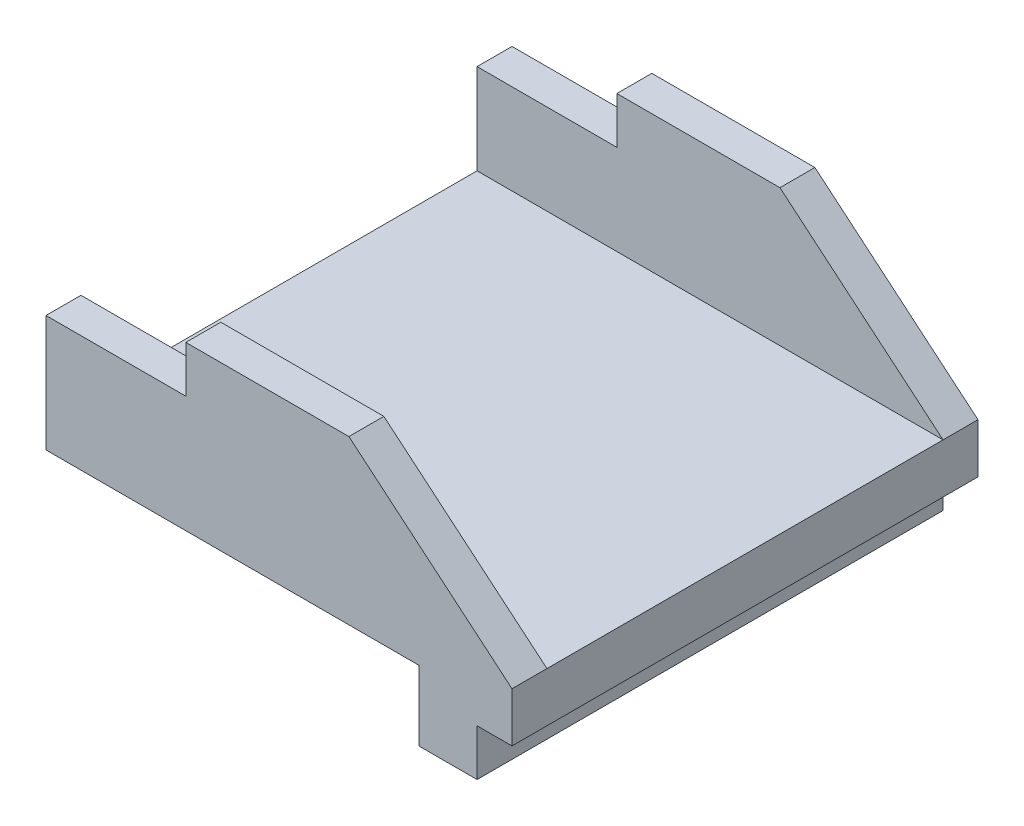
ISO-10303-21;
HEADER;
FILE_DESCRIPTION(('STEP AP214'),'2;1');
FILE_NAME('part.step','',(''),(''),'','','');
FILE_SCHEMA(('AUTOMOTIVE_DESIGN { 1 0 10303 214 1 1 1 1 }'));
ENDSEC;
DATA;
#1=APPLICATION_CONTEXT('core data for automotive mechanical design processes');
#2=APPLICATION_PROTOCOL_DEFINITION('international standard','automotive_design',2000,#1);
#3=PRODUCT_CONTEXT('',#1,'mechanical');
#4=PRODUCT('Part','Part','',(#3));
#5=PRODUCT_RELATED_PRODUCT_CATEGORY('part','',(#4));
#6=PRODUCT_DEFINITION_FORMATION('','',#4);
#7=PRODUCT_DEFINITION_CONTEXT('part definition',#1,'design');
#8=PRODUCT_DEFINITION('design','',#6,#7);
#9=PRODUCT_DEFINITION_SHAPE('','',#8);
#10=(LENGTH_UNIT() NAMED_UNIT(*) SI_UNIT(.MILLI.,.METRE.));
#11=(NAMED_UNIT(*) PLANE_ANGLE_UNIT() SI_UNIT($,.RADIAN.));
#12=(NAMED_UNIT(*) SI_UNIT($,.STERADIAN.) SOLID_ANGLE_UNIT());
#13=UNCERTAINTY_MEASURE_WITH_UNIT(LENGTH_MEASURE(1.E-05),#10,'distance_accuracy_value','');
#14=(GEOMETRIC_REPRESENTATION_CONTEXT(3) GLOBAL_UNCERTAINTY_ASSIGNED_CONTEXT((#13)) GLOBAL_UNIT_ASSIGNED_CONTEXT((#10,
#11,#12)) REPRESENTATION_CONTEXT('',''));
#15=CARTESIAN_POINT('',(0.,0.,0.));
#16=DIRECTION('',(0.,0.,1.));
#17=DIRECTION('',(1.,0.,0.));
#18=AXIS2_PLACEMENT_3D('',#15,#16,#17);
#19=CARTESIAN_POINT('',(-10.,-5.,10.));
#20=DIRECTION('',(1.,0.,0.));
#21=DIRECTION('',(0.,0.,-1.));
#22=AXIS2_PLACEMENT_3D('',#19,#20,#21);
#23=PLANE('',#22);
#24=DIRECTION('',(0.,1.,0.));
#25=VECTOR('',#24,1.);
#26=CARTESIAN_POINT('',(-10.,-5.,8.5));
#27=LINE('',#26,#25);
#28=CARTESIAN_POINT('',(-10.,-0.873697418241024,8.5));
#29=VERTEX_POINT('',#28);
#30=CARTESIAN_POINT('',(-10.,3.,8.5));
#31=VERTEX_POINT('',#30);
#32=EDGE_CURVE('E172',#29,#31,#27,.T.);
#33=ORIENTED_EDGE('',*,*,#32,.F.);
#34=DIRECTION('',(0.,0.,1.));
#35=VECTOR('',#34,1.);
#36=CARTESIAN_POINT('',(-10.,-0.873697418241024,10.));
#37=LINE('',#36,#35);
#38=CARTESIAN_POINT('',(-10.,-0.873697418241022,-8.5));
#39=VERTEX_POINT('',#38);
#40=EDGE_CURVE('E158',#39,#29,#37,.T.);
#41=ORIENTED_EDGE('',*,*,#40,.F.);
#42=DIRECTION('',(0.,-1.,0.));
#43=VECTOR('',#42,1.);
#44=CARTESIAN_POINT('',(-10.,-5.,-8.5));
#45=LINE('',#44,#43);
#46=CARTESIAN_POINT('',(-10.,3.,-8.5));
#47=VERTEX_POINT('',#46);
#48=EDGE_CURVE('E150',#47,#39,#45,.T.);
#49=ORIENTED_EDGE('',*,*,#48,.F.);
#50=DIRECTION('',(0.,0.,1.));
#51=VECTOR('',#50,1.);
#52=CARTESIAN_POINT('',(-10.,3.,-10.));
#53=LINE('',#52,#51);
#54=CARTESIAN_POINT('',(-10.,3.,-10.));
#55=VERTEX_POINT('',#54);
#56=EDGE_CURVE('E240',#55,#47,#53,.T.);
#57=ORIENTED_EDGE('',*,*,#56,.F.);
#58=DIRECTION('',(0.,-1.,0.));
#59=VECTOR('',#58,1.);
#60=CARTESIAN_POINT('',(-10.,-5.,-10.));
#61=LINE('',#60,#59);
#62=CARTESIAN_POINT('',(-10.,-2.,-10.));
#63=VERTEX_POINT('',#62);
#64=EDGE_CURVE('E242',#55,#63,#61,.T.);
#65=ORIENTED_EDGE('',*,*,#64,.T.);
#66=DIRECTION('',(0.,0.,1.));
#67=VECTOR('',#66,1.);
#68=CARTESIAN_POINT('',(-10.,-2.,-10.));
#69=LINE('',#68,#67);
#70=CARTESIAN_POINT('',(-10.,-2.,10.));
#71=VERTEX_POINT('',#70);
#72=EDGE_CURVE('E224',#63,#71,#69,.T.);
#73=ORIENTED_EDGE('',*,*,#72,.T.);
#74=DIRECTION('',(0.,-1.,0.));
#75=VECTOR('',#74,1.);
#76=CARTESIAN_POINT('',(-10.,-5.,10.));
#77=LINE('',#76,#75);
#78=CARTESIAN_POINT('',(-10.,3.,10.));
#79=VERTEX_POINT('',#78);
#80=EDGE_CURVE('E251',#79,#71,#77,.T.);
#81=ORIENTED_EDGE('',*,*,#80,.F.);
#82=EDGE_CURVE('E243',#31,#79,#53,.T.);
#83=ORIENTED_EDGE('',*,*,#82,.F.);
#84=EDGE_LOOP('',(#33,#41,#49,#57,#65,#73,#81,#83));
#85=FACE_BOUND('',#84,.T.);
#86=ADVANCED_FACE('F35',(#85),#23,.F.);
#87=CARTESIAN_POINT('',(10.,5.,10.));
#88=DIRECTION('',(0.,-1.,0.));
#89=DIRECTION('',(1.,0.,0.));
#90=AXIS2_PLACEMENT_3D('',#87,#88,#89);
#91=PLANE('',#90);
#92=DIRECTION('',(-1.,0.,0.));
#93=VECTOR('',#92,1.);
#94=CARTESIAN_POINT('',(20.,5.,8.5));
#95=LINE('',#94,#93);
#96=CARTESIAN_POINT('',(3.,5.,8.5));
#97=VERTEX_POINT('',#96);
#98=CARTESIAN_POINT('',(-4.,5.,8.5));
#99=VERTEX_POINT('',#98);
#100=EDGE_CURVE('E330',#97,#99,#95,.T.);
#101=ORIENTED_EDGE('',*,*,#100,.T.);
#102=DIRECTION('',(0.,0.,1.));
#103=VECTOR('',#102,1.);
#104=CARTESIAN_POINT('',(-4.,5.,-10.));
#105=LINE('',#104,#103);
#106=CARTESIAN_POINT('',(-4.,5.,10.));
#107=VERTEX_POINT('',#106);
#108=EDGE_CURVE('E247',#99,#107,#105,.T.);
#109=ORIENTED_EDGE('',*,*,#108,.T.);
#110=DIRECTION('',(-1.,0.,0.));
#111=VECTOR('',#110,1.);
#112=CARTESIAN_POINT('',(10.,5.,10.));
#113=LINE('',#112,#111);
#114=CARTESIAN_POINT('',(3.,5.,10.));
#115=VERTEX_POINT('',#114);
#116=EDGE_CURVE('E261',#115,#107,#113,.T.);
#117=ORIENTED_EDGE('',*,*,#116,.F.);
#118=DIRECTION('',(0.,0.,1.));
#119=VECTOR('',#118,1.);
#120=CARTESIAN_POINT('',(3.,5.,-10.));
#121=LINE('',#120,#119);
#122=EDGE_CURVE('E200',#97,#115,#121,.T.);
#123=ORIENTED_EDGE('',*,*,#122,.F.);
#124=EDGE_LOOP('',(#101,#109,#117,#123));
#125=FACE_BOUND('',#124,.T.);
#126=ADVANCED_FACE('F328',(#125),#91,.F.);
#127=DIRECTION('',(-1.,0.,0.));
#128=VECTOR('',#127,1.);
#129=CARTESIAN_POINT('',(20.,5.,-8.5));
#130=LINE('',#129,#128);
#131=CARTESIAN_POINT('',(3.,5.,-8.5));
#132=VERTEX_POINT('',#131);
#133=CARTESIAN_POINT('',(-4.,5.,-8.5));
#134=VERTEX_POINT('',#133);
#135=EDGE_CURVE('E168',#132,#134,#130,.T.);
#136=ORIENTED_EDGE('',*,*,#135,.F.);
#137=CARTESIAN_POINT('',(3.,5.,-10.));
#138=VERTEX_POINT('',#137);
#139=EDGE_CURVE('E210',#138,#132,#121,.T.);
#140=ORIENTED_EDGE('',*,*,#139,.F.);
#141=DIRECTION('',(-1.,0.,0.));
#142=VECTOR('',#141,1.);
#143=CARTESIAN_POINT('',(10.,5.,-10.));
#144=LINE('',#143,#142);
#145=CARTESIAN_POINT('',(-4.,5.,-10.));
#146=VERTEX_POINT('',#145);
#147=EDGE_CURVE('E255',#138,#146,#144,.T.);
#148=ORIENTED_EDGE('',*,*,#147,.T.);
#149=EDGE_CURVE('E244',#146,#134,#105,.T.);
#150=ORIENTED_EDGE('',*,*,#149,.T.);
#151=EDGE_LOOP('',(#136,#140,#148,#150));
#152=FACE_BOUND('',#151,.T.);
#153=ADVANCED_FACE('F278',(#152),#91,.F.);
#154=CARTESIAN_POINT('',(0.,3.,-10.));
#155=DIRECTION('',(0.,-1.,0.));
#156=DIRECTION('',(0.,0.,-1.));
#157=AXIS2_PLACEMENT_3D('',#154,#155,#156);
#158=PLANE('',#157);
#159=DIRECTION('',(1.,0.,0.));
#160=VECTOR('',#159,1.);
#161=CARTESIAN_POINT('',(0.,3.,8.5));
#162=LINE('',#161,#160);
#163=CARTESIAN_POINT('',(-4.,3.,8.5));
#164=VERTEX_POINT('',#163);
#165=EDGE_CURVE('E175',#31,#164,#162,.T.);
#166=ORIENTED_EDGE('',*,*,#165,.F.);
#167=ORIENTED_EDGE('',*,*,#82,.T.);
#168=DIRECTION('',(1.,0.,0.));
#169=VECTOR('',#168,1.);
#170=CARTESIAN_POINT('',(0.,3.,10.));
#171=LINE('',#170,#169);
#172=CARTESIAN_POINT('',(-4.,3.,10.));
#173=VERTEX_POINT('',#172);
#174=EDGE_CURVE('E208',#79,#173,#171,.T.);
#175=ORIENTED_EDGE('',*,*,#174,.T.);
#176=DIRECTION('',(0.,0.,1.));
#177=VECTOR('',#176,1.);
#178=CARTESIAN_POINT('',(-4.,3.,-10.));
#179=LINE('',#178,#177);
#180=EDGE_CURVE('E235',#164,#173,#179,.T.);
#181=ORIENTED_EDGE('',*,*,#180,.F.);
#182=EDGE_LOOP('',(#166,#167,#175,#181));
#183=FACE_BOUND('',#182,.T.);
#184=ADVANCED_FACE('F318',(#183),#158,.F.);
#185=DIRECTION('',(-1.,0.,0.));
#186=VECTOR('',#185,1.);
#187=CARTESIAN_POINT('',(0.,3.,-8.5));
#188=LINE('',#187,#186);
#189=CARTESIAN_POINT('',(-4.,3.,-8.5));
#190=VERTEX_POINT('',#189);
#191=EDGE_CURVE('E153',#190,#47,#188,.T.);
#192=ORIENTED_EDGE('',*,*,#191,.F.);
#193=CARTESIAN_POINT('',(-4.,3.,-10.));
#194=VERTEX_POINT('',#193);
#195=EDGE_CURVE('E248',#194,#190,#179,.T.);
#196=ORIENTED_EDGE('',*,*,#195,.F.);
#197=DIRECTION('',(1.,0.,0.));
#198=VECTOR('',#197,1.);
#199=CARTESIAN_POINT('',(0.,3.,-10.));
#200=LINE('',#199,#198);
#201=EDGE_CURVE('E228',#55,#194,#200,.T.);
#202=ORIENTED_EDGE('',*,*,#201,.F.);
#203=ORIENTED_EDGE('',*,*,#56,.T.);
#204=EDGE_LOOP('',(#192,#196,#202,#203));
#205=FACE_BOUND('',#204,.T.);
#206=ADVANCED_FACE('F448',(#205),#158,.F.);
#207=CARTESIAN_POINT('',(-4.,0.,-10.));
#208=DIRECTION('',(1.,0.,0.));
#209=DIRECTION('',(0.,0.,-1.));
#210=AXIS2_PLACEMENT_3D('',#207,#208,#209);
#211=PLANE('',#210);
#212=DIRECTION('',(0.,1.,0.));
#213=VECTOR('',#212,1.);
#214=CARTESIAN_POINT('',(-4.,0.,8.5));
#215=LINE('',#214,#213);
#216=EDGE_CURVE('E173',#164,#99,#215,.T.);
#217=ORIENTED_EDGE('',*,*,#216,.F.);
#218=ORIENTED_EDGE('',*,*,#180,.T.);
#219=DIRECTION('',(0.,1.,0.));
#220=VECTOR('',#219,1.);
#221=CARTESIAN_POINT('',(-4.,0.,10.));
#222=LINE('',#221,#220);
#223=EDGE_CURVE('E232',#173,#107,#222,.T.);
#224=ORIENTED_EDGE('',*,*,#223,.T.);
#225=ORIENTED_EDGE('',*,*,#108,.F.);
#226=EDGE_LOOP('',(#217,#218,#224,#225));
#227=FACE_BOUND('',#226,.T.);
#228=ADVANCED_FACE('F325',(#227),#211,.F.);
#229=DIRECTION('',(0.,-1.,0.));
#230=VECTOR('',#229,1.);
#231=CARTESIAN_POINT('',(-4.,0.,-8.5));
#232=LINE('',#231,#230);
#233=EDGE_CURVE('E332',#134,#190,#232,.T.);
#234=ORIENTED_EDGE('',*,*,#233,.F.);
#235=ORIENTED_EDGE('',*,*,#149,.F.);
#236=DIRECTION('',(0.,1.,0.));
#237=VECTOR('',#236,1.);
#238=CARTESIAN_POINT('',(-4.,0.,-10.));
#239=LINE('',#238,#237);
#240=EDGE_CURVE('E231',#194,#146,#239,.T.);
#241=ORIENTED_EDGE('',*,*,#240,.F.);
#242=ORIENTED_EDGE('',*,*,#195,.T.);
#243=EDGE_LOOP('',(#234,#235,#241,#242));
#244=FACE_BOUND('',#243,.T.);
#245=ADVANCED_FACE('F340',(#244),#211,.F.);
#246=CARTESIAN_POINT('',(3.70154711603014,4.41133207368561,-10.));
#247=DIRECTION('',(-0.642787609686543,-0.766044443118975,0.));
#248=DIRECTION('',(0.766044443118975,-0.642787609686543,0.));
#249=AXIS2_PLACEMENT_3D('',#246,#247,#248);
#250=PLANE('',#249);
#251=DIRECTION('',(0.766044443118975,-0.642787609686543,0.));
#252=VECTOR('',#251,1.);
#253=CARTESIAN_POINT('',(3.70154711603014,4.41133207368561,8.5));
#254=LINE('',#253,#252);
#255=CARTESIAN_POINT('',(10.,-0.873697418241024,8.5));
#256=VERTEX_POINT('',#255);
#257=EDGE_CURVE('E11',#97,#256,#254,.T.);
#258=ORIENTED_EDGE('',*,*,#257,.F.);
#259=ORIENTED_EDGE('',*,*,#122,.T.);
#260=DIRECTION('',(0.766044443118975,-0.642787609686543,0.));
#261=VECTOR('',#260,1.);
#262=CARTESIAN_POINT('',(3.70154711603014,4.41133207368561,10.));
#263=LINE('',#262,#261);
#264=CARTESIAN_POINT('',(10.,-0.873697418241024,10.));
#265=VERTEX_POINT('',#264);
#266=EDGE_CURVE('E201',#115,#265,#263,.T.);
#267=ORIENTED_EDGE('',*,*,#266,.T.);
#268=DIRECTION('',(0.,0.,1.));
#269=VECTOR('',#268,1.);
#270=CARTESIAN_POINT('',(10.,-0.873697418241024,-10.));
#271=LINE('',#270,#269);
#272=EDGE_CURVE('E209',#256,#265,#271,.T.);
#273=ORIENTED_EDGE('',*,*,#272,.F.);
#274=EDGE_LOOP('',(#258,#259,#267,#273));
#275=FACE_BOUND('',#274,.T.);
#276=ADVANCED_FACE('F338',(#275),#250,.F.);
#277=DIRECTION('',(-0.766044443118975,0.642787609686543,0.));
#278=VECTOR('',#277,1.);
#279=CARTESIAN_POINT('',(3.70154711603014,4.41133207368561,-8.5));
#280=LINE('',#279,#278);
#281=CARTESIAN_POINT('',(10.,-0.873697418241024,-8.5));
#282=VERTEX_POINT('',#281);
#283=EDGE_CURVE('E42',#282,#132,#280,.T.);
#284=ORIENTED_EDGE('',*,*,#283,.F.);
#285=CARTESIAN_POINT('',(10.,-0.873697418241024,-10.));
#286=VERTEX_POINT('',#285);
#287=EDGE_CURVE('E205',#286,#282,#271,.T.);
#288=ORIENTED_EDGE('',*,*,#287,.F.);
#289=DIRECTION('',(0.766044443118975,-0.642787609686543,0.));
#290=VECTOR('',#289,1.);
#291=CARTESIAN_POINT('',(3.70154711603014,4.41133207368561,-10.));
#292=LINE('',#291,#290);
#293=EDGE_CURVE('E197',#138,#286,#292,.T.);
#294=ORIENTED_EDGE('',*,*,#293,.F.);
#295=ORIENTED_EDGE('',*,*,#139,.T.);
#296=EDGE_LOOP('',(#284,#288,#294,#295));
#297=FACE_BOUND('',#296,.T.);
#298=ADVANCED_FACE('F281',(#297),#250,.F.);
#299=CARTESIAN_POINT('',(10.,-5.,10.));
#300=DIRECTION('',(0.,1.,0.));
#301=DIRECTION('',(-1.,0.,0.));
#302=AXIS2_PLACEMENT_3D('',#299,#300,#301);
#303=PLANE('',#302);
#304=DIRECTION('',(0.,0.,1.));
#305=VECTOR('',#304,1.);
#306=CARTESIAN_POINT('',(6.,-5.,-10.));
#307=LINE('',#306,#305);
#308=CARTESIAN_POINT('',(6.,-5.,-10.));
#309=VERTEX_POINT('',#308);
#310=CARTESIAN_POINT('',(6.,-5.,10.));
#311=VERTEX_POINT('',#310);
#312=EDGE_CURVE('E204',#309,#311,#307,.T.);
#313=ORIENTED_EDGE('',*,*,#312,.F.);
#314=DIRECTION('',(1.,0.,0.));
#315=VECTOR('',#314,1.);
#316=CARTESIAN_POINT('',(10.,-5.,-10.));
#317=LINE('',#316,#315);
#318=CARTESIAN_POINT('',(8.5,-5.,-10.));
#319=VERTEX_POINT('',#318);
#320=EDGE_CURVE('E266',#309,#319,#317,.T.);
#321=ORIENTED_EDGE('',*,*,#320,.T.);
#322=DIRECTION('',(0.,0.,1.));
#323=VECTOR('',#322,1.);
#324=CARTESIAN_POINT('',(8.5,-5.,-10.));
#325=LINE('',#324,#323);
#326=CARTESIAN_POINT('',(8.5,-5.,10.));
#327=VERTEX_POINT('',#326);
#328=EDGE_CURVE('E57',#319,#327,#325,.T.);
#329=ORIENTED_EDGE('',*,*,#328,.T.);
#330=DIRECTION('',(1.,0.,0.));
#331=VECTOR('',#330,1.);
#332=CARTESIAN_POINT('',(10.,-5.,10.));
#333=LINE('',#332,#331);
#334=EDGE_CURVE('E254',#311,#327,#333,.T.);
#335=ORIENTED_EDGE('',*,*,#334,.F.);
#336=EDGE_LOOP('',(#313,#321,#329,#335));
#337=FACE_BOUND('',#336,.T.);
#338=ADVANCED_FACE('F301',(#337),#303,.F.);
#339=CARTESIAN_POINT('',(10.,-5.,10.));
#340=DIRECTION('',(-1.,0.,0.));
#341=DIRECTION('',(0.,0.,1.));
#342=AXIS2_PLACEMENT_3D('',#339,#340,#341);
#343=PLANE('',#342);
#344=DIRECTION('',(0.,1.,0.));
#345=VECTOR('',#344,1.);
#346=CARTESIAN_POINT('',(10.,-5.,-10.));
#347=LINE('',#346,#345);
#348=CARTESIAN_POINT('',(10.,-3.,-10.));
#349=VERTEX_POINT('',#348);
#350=EDGE_CURVE('E269',#349,#286,#347,.T.);
#351=ORIENTED_EDGE('',*,*,#350,.T.);
#352=ORIENTED_EDGE('',*,*,#287,.T.);
#353=EDGE_CURVE('E165',#282,#256,#271,.T.);
#354=ORIENTED_EDGE('',*,*,#353,.T.);
#355=ORIENTED_EDGE('',*,*,#272,.T.);
#356=DIRECTION('',(0.,1.,0.));
#357=VECTOR('',#356,1.);
#358=CARTESIAN_POINT('',(10.,-5.,10.));
#359=LINE('',#358,#357);
#360=CARTESIAN_POINT('',(10.,-3.,10.));
#361=VERTEX_POINT('',#360);
#362=EDGE_CURVE('E258',#361,#265,#359,.T.);
#363=ORIENTED_EDGE('',*,*,#362,.F.);
#364=DIRECTION('',(0.,0.,1.));
#365=VECTOR('',#364,1.);
#366=CARTESIAN_POINT('',(10.,-3.,-10.));
#367=LINE('',#366,#365);
#368=EDGE_CURVE('E192',#349,#361,#367,.T.);
#369=ORIENTED_EDGE('',*,*,#368,.F.);
#370=EDGE_LOOP('',(#351,#352,#354,#355,#363,#369));
#371=FACE_BOUND('',#370,.T.);
#372=ADVANCED_FACE('F288',(#371),#343,.F.);
#373=CARTESIAN_POINT('',(0.,0.,10.));
#374=DIRECTION('',(0.,0.,1.));
#375=DIRECTION('',(1.,0.,0.));
#376=AXIS2_PLACEMENT_3D('',#373,#374,#375);
#377=PLANE('',#376);
#378=ORIENTED_EDGE('',*,*,#266,.F.);
#379=ORIENTED_EDGE('',*,*,#116,.T.);
#380=ORIENTED_EDGE('',*,*,#223,.F.);
#381=ORIENTED_EDGE('',*,*,#174,.F.);
#382=ORIENTED_EDGE('',*,*,#80,.T.);
#383=DIRECTION('',(1.,0.,0.));
#384=VECTOR('',#383,1.);
#385=CARTESIAN_POINT('',(0.,-2.,10.));
#386=LINE('',#385,#384);
#387=CARTESIAN_POINT('',(6.,-2.,10.));
#388=VERTEX_POINT('',#387);
#389=EDGE_CURVE('E216',#71,#388,#386,.T.);
#390=ORIENTED_EDGE('',*,*,#389,.T.);
#391=DIRECTION('',(0.,-1.,0.));
#392=VECTOR('',#391,1.);
#393=CARTESIAN_POINT('',(6.,0.,10.));
#394=LINE('',#393,#392);
#395=EDGE_CURVE('E194',#388,#311,#394,.T.);
#396=ORIENTED_EDGE('',*,*,#395,.T.);
#397=ORIENTED_EDGE('',*,*,#334,.T.);
#398=DIRECTION('',(0.,1.,0.));
#399=VECTOR('',#398,1.);
#400=CARTESIAN_POINT('',(8.5,0.,10.));
#401=LINE('',#400,#399);
#402=CARTESIAN_POINT('',(8.5,-3.,10.));
#403=VERTEX_POINT('',#402);
#404=EDGE_CURVE('E185',#327,#403,#401,.T.);
#405=ORIENTED_EDGE('',*,*,#404,.T.);
#406=DIRECTION('',(1.,0.,0.));
#407=VECTOR('',#406,1.);
#408=CARTESIAN_POINT('',(0.,-3.,10.));
#409=LINE('',#408,#407);
#410=EDGE_CURVE('E181',#403,#361,#409,.T.);
#411=ORIENTED_EDGE('',*,*,#410,.T.);
#412=ORIENTED_EDGE('',*,*,#362,.T.);
#413=EDGE_LOOP('',(#378,#379,#380,#381,#382,#390,#396,#397,#405,#411,#412));
#414=FACE_BOUND('',#413,.T.);
#415=ADVANCED_FACE('F296',(#414),#377,.T.);
#416=CARTESIAN_POINT('',(0.,0.,-10.));
#417=DIRECTION('',(0.,0.,1.));
#418=DIRECTION('',(1.,0.,0.));
#419=AXIS2_PLACEMENT_3D('',#416,#417,#418);
#420=PLANE('',#419);
#421=ORIENTED_EDGE('',*,*,#147,.F.);
#422=ORIENTED_EDGE('',*,*,#293,.T.);
#423=ORIENTED_EDGE('',*,*,#350,.F.);
#424=DIRECTION('',(1.,0.,0.));
#425=VECTOR('',#424,1.);
#426=CARTESIAN_POINT('',(0.,-3.,-10.));
#427=LINE('',#426,#425);
#428=CARTESIAN_POINT('',(8.5,-3.,-10.));
#429=VERTEX_POINT('',#428);
#430=EDGE_CURVE('E182',#429,#349,#427,.T.);
#431=ORIENTED_EDGE('',*,*,#430,.F.);
#432=DIRECTION('',(0.,1.,0.));
#433=VECTOR('',#432,1.);
#434=CARTESIAN_POINT('',(8.5,0.,-10.));
#435=LINE('',#434,#433);
#436=EDGE_CURVE('E184',#319,#429,#435,.T.);
#437=ORIENTED_EDGE('',*,*,#436,.F.);
#438=ORIENTED_EDGE('',*,*,#320,.F.);
#439=DIRECTION('',(0.,-1.,0.));
#440=VECTOR('',#439,1.);
#441=CARTESIAN_POINT('',(6.,0.,-10.));
#442=LINE('',#441,#440);
#443=CARTESIAN_POINT('',(6.,-2.,-10.));
#444=VERTEX_POINT('',#443);
#445=EDGE_CURVE('E213',#444,#309,#442,.T.);
#446=ORIENTED_EDGE('',*,*,#445,.F.);
#447=DIRECTION('',(1.,0.,0.));
#448=VECTOR('',#447,1.);
#449=CARTESIAN_POINT('',(0.,-2.,-10.));
#450=LINE('',#449,#448);
#451=EDGE_CURVE('E215',#63,#444,#450,.T.);
#452=ORIENTED_EDGE('',*,*,#451,.F.);
#453=ORIENTED_EDGE('',*,*,#64,.F.);
#454=ORIENTED_EDGE('',*,*,#201,.T.);
#455=ORIENTED_EDGE('',*,*,#240,.T.);
#456=EDGE_LOOP('',(#421,#422,#423,#431,#437,#438,#446,#452,#453,#454,#455));
#457=FACE_BOUND('',#456,.T.);
#458=ADVANCED_FACE('F284',(#457),#420,.F.);
#459=CARTESIAN_POINT('',(0.,-3.,-10.));
#460=DIRECTION('',(0.,-1.,0.));
#461=DIRECTION('',(0.,0.,-1.));
#462=AXIS2_PLACEMENT_3D('',#459,#460,#461);
#463=PLANE('',#462);
#464=ORIENTED_EDGE('',*,*,#410,.F.);
#465=DIRECTION('',(0.,0.,1.));
#466=VECTOR('',#465,1.);
#467=CARTESIAN_POINT('',(8.5,-3.,-10.));
#468=LINE('',#467,#466);
#469=EDGE_CURVE('E187',#429,#403,#468,.T.);
#470=ORIENTED_EDGE('',*,*,#469,.F.);
#471=ORIENTED_EDGE('',*,*,#430,.T.);
#472=ORIENTED_EDGE('',*,*,#368,.T.);
#473=EDGE_LOOP('',(#464,#470,#471,#472));
#474=FACE_BOUND('',#473,.T.);
#475=ADVANCED_FACE('F292',(#474),#463,.T.);
#476=CARTESIAN_POINT('',(8.5,0.,-10.));
#477=DIRECTION('',(1.,0.,0.));
#478=DIRECTION('',(0.,0.,-1.));
#479=AXIS2_PLACEMENT_3D('',#476,#477,#478);
#480=PLANE('',#479);
#481=ORIENTED_EDGE('',*,*,#404,.F.);
#482=ORIENTED_EDGE('',*,*,#328,.F.);
#483=ORIENTED_EDGE('',*,*,#436,.T.);
#484=ORIENTED_EDGE('',*,*,#469,.T.);
#485=EDGE_LOOP('',(#481,#482,#483,#484));
#486=FACE_BOUND('',#485,.T.);
#487=ADVANCED_FACE('F298',(#486),#480,.T.);
#488=CARTESIAN_POINT('',(6.,0.,-10.));
#489=DIRECTION('',(-1.,0.,0.));
#490=DIRECTION('',(0.,0.,1.));
#491=AXIS2_PLACEMENT_3D('',#488,#489,#490);
#492=PLANE('',#491);
#493=ORIENTED_EDGE('',*,*,#395,.F.);
#494=DIRECTION('',(0.,0.,1.));
#495=VECTOR('',#494,1.);
#496=CARTESIAN_POINT('',(6.,-2.,-10.));
#497=LINE('',#496,#495);
#498=EDGE_CURVE('E218',#444,#388,#497,.T.);
#499=ORIENTED_EDGE('',*,*,#498,.F.);
#500=ORIENTED_EDGE('',*,*,#445,.T.);
#501=ORIENTED_EDGE('',*,*,#312,.T.);
#502=EDGE_LOOP('',(#493,#499,#500,#501));
#503=FACE_BOUND('',#502,.T.);
#504=ADVANCED_FACE('F309',(#503),#492,.T.);
#505=CARTESIAN_POINT('',(0.,-2.,-10.));
#506=DIRECTION('',(0.,-1.,0.));
#507=DIRECTION('',(0.,0.,-1.));
#508=AXIS2_PLACEMENT_3D('',#505,#506,#507);
#509=PLANE('',#508);
#510=ORIENTED_EDGE('',*,*,#389,.F.);
#511=ORIENTED_EDGE('',*,*,#72,.F.);
#512=ORIENTED_EDGE('',*,*,#451,.T.);
#513=ORIENTED_EDGE('',*,*,#498,.T.);
#514=EDGE_LOOP('',(#510,#511,#512,#513));
#515=FACE_BOUND('',#514,.T.);
#516=ADVANCED_FACE('F311',(#515),#509,.T.);
#517=CARTESIAN_POINT('',(20.,5.,8.5));
#518=DIRECTION('',(0.,0.,-1.));
#519=DIRECTION('',(-1.,0.,0.));
#520=AXIS2_PLACEMENT_3D('',#517,#518,#519);
#521=PLANE('',#520);
#522=ORIENTED_EDGE('',*,*,#32,.T.);
#523=ORIENTED_EDGE('',*,*,#165,.T.);
#524=ORIENTED_EDGE('',*,*,#216,.T.);
#525=ORIENTED_EDGE('',*,*,#100,.F.);
#526=ORIENTED_EDGE('',*,*,#257,.T.);
#527=DIRECTION('',(-1.,0.,0.));
#528=VECTOR('',#527,1.);
#529=CARTESIAN_POINT('',(20.,-0.873697418241024,8.5));
#530=LINE('',#529,#528);
#531=EDGE_CURVE('E167',#256,#29,#530,.T.);
#532=ORIENTED_EDGE('',*,*,#531,.T.);
#533=EDGE_LOOP('',(#522,#523,#524,#525,#526,#532));
#534=FACE_BOUND('',#533,.T.);
#535=ADVANCED_FACE('F321',(#534),#521,.T.);
#536=CARTESIAN_POINT('',(20.,-0.873697418241024,8.5));
#537=DIRECTION('',(0.,1.,0.));
#538=DIRECTION('',(0.,0.,1.));
#539=AXIS2_PLACEMENT_3D('',#536,#537,#538);
#540=PLANE('',#539);
#541=ORIENTED_EDGE('',*,*,#40,.T.);
#542=ORIENTED_EDGE('',*,*,#531,.F.);
#543=ORIENTED_EDGE('',*,*,#353,.F.);
#544=DIRECTION('',(-1.,0.,0.));
#545=VECTOR('',#544,1.);
#546=CARTESIAN_POINT('',(20.,-0.873697418241022,-8.5));
#547=LINE('',#546,#545);
#548=EDGE_CURVE('E49',#282,#39,#547,.T.);
#549=ORIENTED_EDGE('',*,*,#548,.T.);
#550=EDGE_LOOP('',(#541,#542,#543,#549));
#551=FACE_BOUND('',#550,.T.);
#552=ADVANCED_FACE('F161',(#551),#540,.T.);
#553=CARTESIAN_POINT('',(20.,5.,-8.5));
#554=DIRECTION('',(0.,0.,1.));
#555=DIRECTION('',(1.,0.,0.));
#556=AXIS2_PLACEMENT_3D('',#553,#554,#555);
#557=PLANE('',#556);
#558=ORIENTED_EDGE('',*,*,#48,.T.);
#559=ORIENTED_EDGE('',*,*,#548,.F.);
#560=ORIENTED_EDGE('',*,*,#283,.T.);
#561=ORIENTED_EDGE('',*,*,#135,.T.);
#562=ORIENTED_EDGE('',*,*,#233,.T.);
#563=ORIENTED_EDGE('',*,*,#191,.T.);
#564=EDGE_LOOP('',(#558,#559,#560,#561,#562,#563));
#565=FACE_BOUND('',#564,.T.);
#566=ADVANCED_FACE('F151',(#565),#557,.T.);
#567=CLOSED_SHELL('',(#86,#126,#153,#184,#206,#228,#245,#276,#298,#338,#372,#415,#458,#475,#487,
#504,#516,#535,#552,#566));
#568=MANIFOLD_SOLID_BREP('B2',#567);
#569=ADVANCED_BREP_SHAPE_REPRESENTATION('',(#18,#568),#14);
#570=SHAPE_DEFINITION_REPRESENTATION(#9,#569);
ENDSEC;
END-ISO-10303-21;
